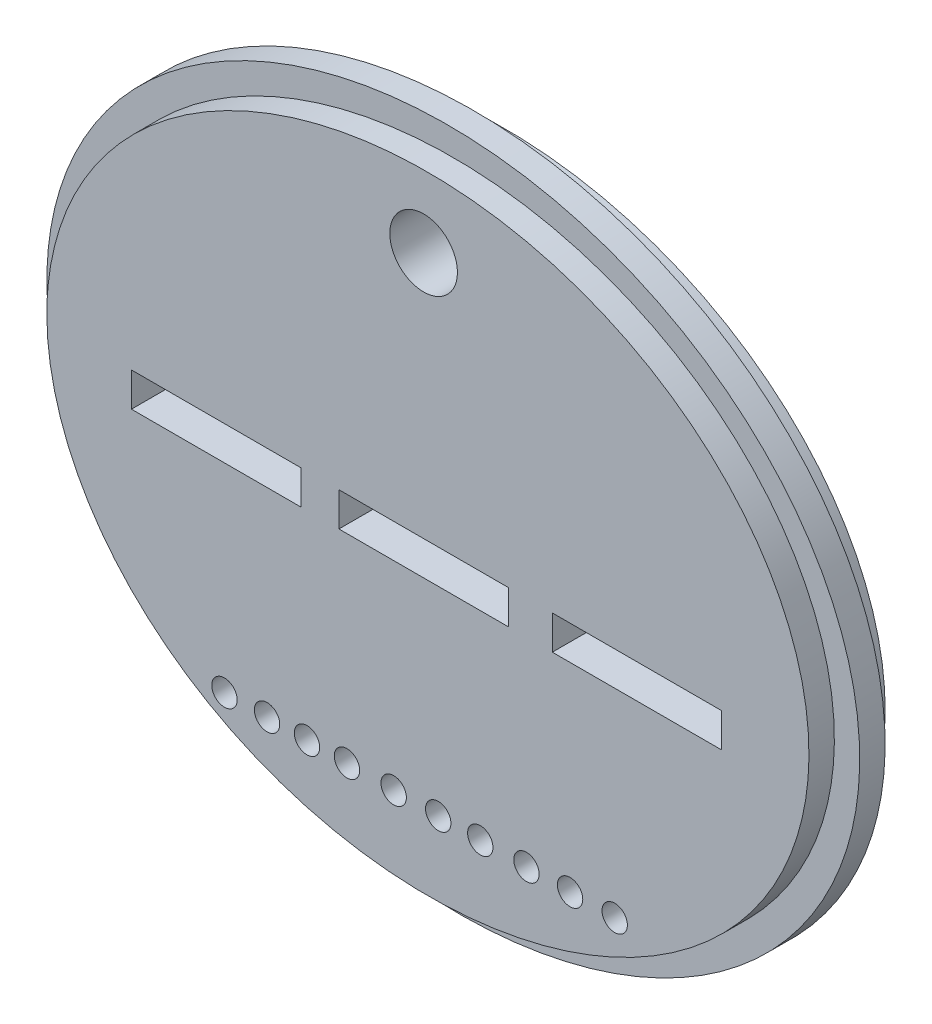
ISO-10303-21;
HEADER;
FILE_DESCRIPTION(('STEP AP214'),'2;1');
FILE_NAME('part.step','',(''),(''),'','','');
FILE_SCHEMA(('AUTOMOTIVE_DESIGN { 1 0 10303 214 1 1 1 1 }'));
ENDSEC;
DATA;
#1=APPLICATION_CONTEXT('core data for automotive mechanical design processes');
#2=APPLICATION_PROTOCOL_DEFINITION('international standard','automotive_design',2000,#1);
#3=PRODUCT_CONTEXT('',#1,'mechanical');
#4=PRODUCT('Part','Part','',(#3));
#5=PRODUCT_RELATED_PRODUCT_CATEGORY('part','',(#4));
#6=PRODUCT_DEFINITION_FORMATION('','',#4);
#7=PRODUCT_DEFINITION_CONTEXT('part definition',#1,'design');
#8=PRODUCT_DEFINITION('design','',#6,#7);
#9=PRODUCT_DEFINITION_SHAPE('','',#8);
#10=(LENGTH_UNIT() NAMED_UNIT(*) SI_UNIT(.MILLI.,.METRE.));
#11=(NAMED_UNIT(*) PLANE_ANGLE_UNIT() SI_UNIT($,.RADIAN.));
#12=(NAMED_UNIT(*) SI_UNIT($,.STERADIAN.) SOLID_ANGLE_UNIT());
#13=UNCERTAINTY_MEASURE_WITH_UNIT(LENGTH_MEASURE(1.E-05),#10,'distance_accuracy_value','');
#14=(GEOMETRIC_REPRESENTATION_CONTEXT(3) GLOBAL_UNCERTAINTY_ASSIGNED_CONTEXT((#13)) GLOBAL_UNIT_ASSIGNED_CONTEXT((#10,
#11,#12)) REPRESENTATION_CONTEXT('',''));
#15=CARTESIAN_POINT('',(0.,0.,0.));
#16=DIRECTION('',(0.,0.,1.));
#17=DIRECTION('',(1.,0.,0.));
#18=AXIS2_PLACEMENT_3D('',#15,#16,#17);
#19=CARTESIAN_POINT('',(0.,0.,3.));
#20=DIRECTION('',(0.,0.,1.));
#21=DIRECTION('',(-0.999405556384513,0.0344751195467531,0.));
#22=AXIS2_PLACEMENT_3D('',#19,#20,#21);
#23=ELLIPSE('',#22,48.,40.);
#24=DIRECTION('',(0.,0.,-1.));
#25=VECTOR('',#24,1.);
#26=SURFACE_OF_LINEAR_EXTRUSION('',#23,#25);
#27=CARTESIAN_POINT('',(-47.9714667064566,1.65480573824415,3.));
#28=VERTEX_POINT('',#27);
#29=EDGE_CURVE('E49',#28,#28,#23,.T.);
#30=ORIENTED_EDGE('',*,*,#29,.F.);
#31=EDGE_LOOP('',(#30));
#32=FACE_BOUND('',#31,.T.);
#33=CARTESIAN_POINT('',(0.,0.,0.));
#34=DIRECTION('',(0.,0.,1.));
#35=DIRECTION('',(-0.999405556384513,0.0344751195467531,0.));
#36=AXIS2_PLACEMENT_3D('',#33,#34,#35);
#37=ELLIPSE('',#36,48.,40.);
#38=CARTESIAN_POINT('',(-47.9714667064566,1.65480573824415,0.));
#39=VERTEX_POINT('',#38);
#40=EDGE_CURVE('E394',#39,#39,#37,.T.);
#41=ORIENTED_EDGE('',*,*,#40,.T.);
#42=EDGE_LOOP('',(#41));
#43=FACE_BOUND('',#42,.T.);
#44=ADVANCED_FACE('F39',(#32,#43),#26,.F.);
#45=CARTESIAN_POINT('',(0.,0.,3.));
#46=DIRECTION('',(0.,0.,1.));
#47=DIRECTION('',(1.,0.,0.));
#48=AXIS2_PLACEMENT_3D('',#45,#46,#47);
#49=PLANE('',#48);
#50=CARTESIAN_POINT('',(0.,0.,3.));
#51=DIRECTION('',(0.,0.,1.));
#52=DIRECTION('',(-1.,0.,0.));
#53=AXIS2_PLACEMENT_3D('',#50,#51,#52);
#54=ELLIPSE('',#53,45.,37.);
#55=CARTESIAN_POINT('',(-45.,0.,3.));
#56=VERTEX_POINT('',#55);
#57=EDGE_CURVE('E11',#56,#56,#54,.T.);
#58=ORIENTED_EDGE('',*,*,#57,.F.);
#59=EDGE_LOOP('',(#58));
#60=FACE_BOUND('',#59,.T.);
#61=ORIENTED_EDGE('',*,*,#29,.T.);
#62=EDGE_LOOP('',(#61));
#63=FACE_BOUND('',#62,.T.);
#64=ADVANCED_FACE('F373',(#60,#63),#49,.T.);
#65=CARTESIAN_POINT('',(0.,0.,0.));
#66=DIRECTION('',(0.,0.,1.));
#67=DIRECTION('',(1.,0.,0.));
#68=AXIS2_PLACEMENT_3D('',#65,#66,#67);
#69=PLANE('',#68);
#70=CARTESIAN_POINT('',(0.,0.,0.));
#71=DIRECTION('',(0.,0.,1.));
#72=DIRECTION('',(-1.,0.,0.));
#73=AXIS2_PLACEMENT_3D('',#70,#71,#72);
#74=ELLIPSE('',#73,45.,37.);
#75=CARTESIAN_POINT('',(-45.,0.,0.));
#76=VERTEX_POINT('',#75);
#77=EDGE_CURVE('E43',#76,#76,#74,.T.);
#78=ORIENTED_EDGE('',*,*,#77,.T.);
#79=EDGE_LOOP('',(#78));
#80=FACE_BOUND('',#79,.T.);
#81=ORIENTED_EDGE('',*,*,#40,.F.);
#82=EDGE_LOOP('',(#81));
#83=FACE_BOUND('',#82,.T.);
#84=ADVANCED_FACE('F375',(#80,#83),#69,.F.);
#85=CARTESIAN_POINT('',(0.,0.,-3.));
#86=DIRECTION('',(0.,0.,1.));
#87=DIRECTION('',(1.,0.,0.));
#88=AXIS2_PLACEMENT_3D('',#85,#86,#87);
#89=PLANE('',#88);
#90=CARTESIAN_POINT('',(16.7871489350802,-28.2262210024839,-3.));
#91=DIRECTION('',(0.,0.,1.));
#92=DIRECTION('',(1.,0.,0.));
#93=AXIS2_PLACEMENT_3D('',#90,#91,#92);
#94=CIRCLE('',#93,1.5);
#95=CARTESIAN_POINT('',(18.2871489350802,-28.2262210024839,-3.));
#96=VERTEX_POINT('',#95);
#97=EDGE_CURVE('E352',#96,#96,#94,.T.);
#98=ORIENTED_EDGE('',*,*,#97,.T.);
#99=EDGE_LOOP('',(#98));
#100=FACE_BOUND('',#99,.T.);
#101=CARTESIAN_POINT('',(11.6399103324198,-28.2262210024839,-3.));
#102=DIRECTION('',(0.,0.,1.));
#103=DIRECTION('',(1.,0.,0.));
#104=AXIS2_PLACEMENT_3D('',#101,#102,#103);
#105=CIRCLE('',#104,1.5);
#106=CARTESIAN_POINT('',(13.1399103324198,-28.2262210024839,-3.));
#107=VERTEX_POINT('',#106);
#108=EDGE_CURVE('E348',#107,#107,#105,.T.);
#109=ORIENTED_EDGE('',*,*,#108,.T.);
#110=EDGE_LOOP('',(#109));
#111=FACE_BOUND('',#110,.T.);
#112=CARTESIAN_POINT('',(6.18604048680282,-28.2262210024839,-3.));
#113=DIRECTION('',(0.,0.,1.));
#114=DIRECTION('',(1.,0.,0.));
#115=AXIS2_PLACEMENT_3D('',#112,#113,#114);
#116=CIRCLE('',#115,1.5);
#117=CARTESIAN_POINT('',(7.68604048680283,-28.2262210024839,-3.));
#118=VERTEX_POINT('',#117);
#119=EDGE_CURVE('E344',#118,#118,#116,.T.);
#120=ORIENTED_EDGE('',*,*,#119,.T.);
#121=EDGE_LOOP('',(#120));
#122=FACE_BOUND('',#121,.T.);
#123=CARTESIAN_POINT('',(1.22176721070844,-28.2262210024839,-3.));
#124=DIRECTION('',(0.,0.,1.));
#125=DIRECTION('',(1.,0.,0.));
#126=AXIS2_PLACEMENT_3D('',#123,#124,#125);
#127=CIRCLE('',#126,1.5);
#128=CARTESIAN_POINT('',(2.72176721070844,-28.2262210024839,-3.));
#129=VERTEX_POINT('',#128);
#130=EDGE_CURVE('E340',#129,#129,#127,.T.);
#131=ORIENTED_EDGE('',*,*,#130,.T.);
#132=EDGE_LOOP('',(#131));
#133=FACE_BOUND('',#132,.T.);
#134=CARTESIAN_POINT('',(-4.04378870700839,-28.2262210024839,-3.));
#135=DIRECTION('',(0.,0.,1.));
#136=DIRECTION('',(1.,0.,0.));
#137=AXIS2_PLACEMENT_3D('',#134,#135,#136);
#138=CIRCLE('',#137,1.5);
#139=CARTESIAN_POINT('',(-2.54378870700839,-28.2262210024839,-3.));
#140=VERTEX_POINT('',#139);
#141=EDGE_CURVE('E336',#140,#140,#138,.T.);
#142=ORIENTED_EDGE('',*,*,#141,.T.);
#143=EDGE_LOOP('',(#142));
#144=FACE_BOUND('',#143,.T.);
#145=CARTESIAN_POINT('',(-9.55886042839893,-28.2262210024839,-3.));
#146=DIRECTION('',(0.,0.,1.));
#147=DIRECTION('',(1.,0.,0.));
#148=AXIS2_PLACEMENT_3D('',#145,#146,#147);
#149=CIRCLE('',#148,1.5);
#150=CARTESIAN_POINT('',(-8.05886042839893,-28.2262210024839,-3.));
#151=VERTEX_POINT('',#150);
#152=EDGE_CURVE('E332',#151,#151,#149,.T.);
#153=ORIENTED_EDGE('',*,*,#152,.T.);
#154=EDGE_LOOP('',(#153));
#155=FACE_BOUND('',#154,.T.);
#156=CARTESIAN_POINT('',(-14.2767144594771,-28.226221002484,-3.));
#157=DIRECTION('',(0.,0.,1.));
#158=DIRECTION('',(1.,0.,0.));
#159=AXIS2_PLACEMENT_3D('',#156,#157,#158);
#160=CIRCLE('',#159,1.5);
#161=CARTESIAN_POINT('',(-12.7767144594771,-28.226221002484,-3.));
#162=VERTEX_POINT('',#161);
#163=EDGE_CURVE('E328',#162,#162,#160,.T.);
#164=ORIENTED_EDGE('',*,*,#163,.T.);
#165=EDGE_LOOP('',(#164));
#166=FACE_BOUND('',#165,.T.);
#167=CARTESIAN_POINT('',(-18.9953449348153,-28.226221002484,-3.));
#168=DIRECTION('',(0.,0.,1.));
#169=DIRECTION('',(1.,0.,0.));
#170=AXIS2_PLACEMENT_3D('',#167,#168,#169);
#171=CIRCLE('',#170,1.5);
#172=CARTESIAN_POINT('',(-17.4953449348153,-28.226221002484,-3.));
#173=VERTEX_POINT('',#172);
#174=EDGE_CURVE('E324',#173,#173,#171,.T.);
#175=ORIENTED_EDGE('',*,*,#174,.T.);
#176=EDGE_LOOP('',(#175));
#177=FACE_BOUND('',#176,.T.);
#178=DIRECTION('',(1.,0.,0.));
#179=VECTOR('',#178,1.);
#180=CARTESIAN_POINT('',(0.,-4.73896392291095,-3.));
#181=LINE('',#180,#179);
#182=CARTESIAN_POINT('',(-35.0077483121449,-4.73896392291095,-3.));
#183=VERTEX_POINT('',#182);
#184=CARTESIAN_POINT('',(-15.0077483121449,-4.73896392291095,-3.));
#185=VERTEX_POINT('',#184);
#186=EDGE_CURVE('E316',#183,#185,#181,.T.);
#187=ORIENTED_EDGE('',*,*,#186,.T.);
#188=DIRECTION('',(0.,1.,0.));
#189=VECTOR('',#188,1.);
#190=CARTESIAN_POINT('',(-15.0077483121449,0.,-3.));
#191=LINE('',#190,#189);
#192=CARTESIAN_POINT('',(-15.0077483121449,-0.723465120707094,-3.));
#193=VERTEX_POINT('',#192);
#194=EDGE_CURVE('E320',#185,#193,#191,.T.);
#195=ORIENTED_EDGE('',*,*,#194,.T.);
#196=DIRECTION('',(-1.,0.,0.));
#197=VECTOR('',#196,1.);
#198=CARTESIAN_POINT('',(0.,-0.723465120707092,-3.));
#199=LINE('',#198,#197);
#200=CARTESIAN_POINT('',(-35.0077483121449,-0.723465120707097,-3.));
#201=VERTEX_POINT('',#200);
#202=EDGE_CURVE('E308',#193,#201,#199,.T.);
#203=ORIENTED_EDGE('',*,*,#202,.T.);
#204=DIRECTION('',(0.,-1.,0.));
#205=VECTOR('',#204,1.);
#206=CARTESIAN_POINT('',(-35.0077483121449,0.,-3.));
#207=LINE('',#206,#205);
#208=EDGE_CURVE('E312',#201,#183,#207,.T.);
#209=ORIENTED_EDGE('',*,*,#208,.T.);
#210=EDGE_LOOP('',(#187,#195,#203,#209));
#211=FACE_BOUND('',#210,.T.);
#212=DIRECTION('',(1.,0.,0.));
#213=VECTOR('',#212,1.);
#214=CARTESIAN_POINT('',(0.,-4.73896392291095,-3.));
#215=LINE('',#214,#213);
#216=CARTESIAN_POINT('',(-10.5072318027535,-4.73896392291095,-3.));
#217=VERTEX_POINT('',#216);
#218=CARTESIAN_POINT('',(9.49276819724652,-4.73896392291095,-3.));
#219=VERTEX_POINT('',#218);
#220=EDGE_CURVE('E300',#217,#219,#215,.T.);
#221=ORIENTED_EDGE('',*,*,#220,.T.);
#222=DIRECTION('',(0.,1.,0.));
#223=VECTOR('',#222,1.);
#224=CARTESIAN_POINT('',(9.49276819724652,0.,-3.));
#225=LINE('',#224,#223);
#226=CARTESIAN_POINT('',(9.49276819724652,-0.723465120707092,-3.));
#227=VERTEX_POINT('',#226);
#228=EDGE_CURVE('E304',#219,#227,#225,.T.);
#229=ORIENTED_EDGE('',*,*,#228,.T.);
#230=DIRECTION('',(-1.,0.,0.));
#231=VECTOR('',#230,1.);
#232=CARTESIAN_POINT('',(0.,-0.723465120707093,-3.));
#233=LINE('',#232,#231);
#234=CARTESIAN_POINT('',(-10.5072318027535,-0.723465120707094,-3.));
#235=VERTEX_POINT('',#234);
#236=EDGE_CURVE('E295',#227,#235,#233,.T.);
#237=ORIENTED_EDGE('',*,*,#236,.T.);
#238=DIRECTION('',(0.,-1.,0.));
#239=VECTOR('',#238,1.);
#240=CARTESIAN_POINT('',(-10.5072318027535,0.,-3.));
#241=LINE('',#240,#239);
#242=EDGE_CURVE('E136',#235,#217,#241,.T.);
#243=ORIENTED_EDGE('',*,*,#242,.T.);
#244=EDGE_LOOP('',(#221,#229,#237,#243));
#245=FACE_BOUND('',#244,.T.);
#246=DIRECTION('',(1.,0.,0.));
#247=VECTOR('',#246,1.);
#248=CARTESIAN_POINT('',(0.,-4.73896392291096,-3.));
#249=LINE('',#248,#247);
#250=CARTESIAN_POINT('',(14.6929491709074,-4.73896392291095,-3.));
#251=VERTEX_POINT('',#250);
#252=CARTESIAN_POINT('',(34.6929491709074,-4.73896392291095,-3.));
#253=VERTEX_POINT('',#252);
#254=EDGE_CURVE('E287',#251,#253,#249,.T.);
#255=ORIENTED_EDGE('',*,*,#254,.T.);
#256=DIRECTION('',(0.,1.,0.));
#257=VECTOR('',#256,1.);
#258=CARTESIAN_POINT('',(34.6929491709074,0.,-3.));
#259=LINE('',#258,#257);
#260=CARTESIAN_POINT('',(34.6929491709074,-0.723465120707094,-3.));
#261=VERTEX_POINT('',#260);
#262=EDGE_CURVE('E291',#253,#261,#259,.T.);
#263=ORIENTED_EDGE('',*,*,#262,.T.);
#264=DIRECTION('',(-1.,0.,0.));
#265=VECTOR('',#264,1.);
#266=CARTESIAN_POINT('',(0.,-0.723465120707098,-3.));
#267=LINE('',#266,#265);
#268=CARTESIAN_POINT('',(14.6929491709074,-0.723465120707097,-3.));
#269=VERTEX_POINT('',#268);
#270=EDGE_CURVE('E279',#261,#269,#267,.T.);
#271=ORIENTED_EDGE('',*,*,#270,.T.);
#272=DIRECTION('',(0.,-1.,0.));
#273=VECTOR('',#272,1.);
#274=CARTESIAN_POINT('',(14.6929491709074,0.,-3.));
#275=LINE('',#274,#273);
#276=EDGE_CURVE('E283',#269,#251,#275,.T.);
#277=ORIENTED_EDGE('',*,*,#276,.T.);
#278=EDGE_LOOP('',(#255,#263,#271,#277));
#279=FACE_BOUND('',#278,.T.);
#280=CARTESIAN_POINT('',(-24.0239847170827,-28.226221002484,-3.));
#281=DIRECTION('',(0.,0.,1.));
#282=DIRECTION('',(1.,0.,0.));
#283=AXIS2_PLACEMENT_3D('',#280,#281,#282);
#284=CIRCLE('',#283,1.5);
#285=CARTESIAN_POINT('',(-22.5239847170827,-28.226221002484,-3.));
#286=VERTEX_POINT('',#285);
#287=EDGE_CURVE('E275',#286,#286,#284,.T.);
#288=ORIENTED_EDGE('',*,*,#287,.T.);
#289=EDGE_LOOP('',(#288));
#290=FACE_BOUND('',#289,.T.);
#291=CARTESIAN_POINT('',(-0.507231802753479,28.4930066817388,-3.));
#292=DIRECTION('',(0.,0.,1.));
#293=DIRECTION('',(1.,0.,0.));
#294=AXIS2_PLACEMENT_3D('',#291,#292,#293);
#295=CIRCLE('',#294,3.99291984746983);
#296=CARTESIAN_POINT('',(3.48568804471635,28.4930066817388,-3.));
#297=VERTEX_POINT('',#296);
#298=EDGE_CURVE('E271',#297,#297,#295,.T.);
#299=ORIENTED_EDGE('',*,*,#298,.T.);
#300=EDGE_LOOP('',(#299));
#301=FACE_BOUND('',#300,.T.);
#302=CARTESIAN_POINT('',(22.0580534541241,-28.2262210024839,-3.));
#303=DIRECTION('',(0.,0.,1.));
#304=DIRECTION('',(1.,0.,0.));
#305=AXIS2_PLACEMENT_3D('',#302,#303,#304);
#306=CIRCLE('',#305,1.5);
#307=CARTESIAN_POINT('',(23.5580534541242,-28.2262210024839,-3.));
#308=VERTEX_POINT('',#307);
#309=EDGE_CURVE('E267',#308,#308,#306,.T.);
#310=ORIENTED_EDGE('',*,*,#309,.T.);
#311=EDGE_LOOP('',(#310));
#312=FACE_BOUND('',#311,.T.);
#313=CARTESIAN_POINT('',(0.,0.,-3.));
#314=DIRECTION('',(0.,0.,1.));
#315=DIRECTION('',(-1.,0.,0.));
#316=AXIS2_PLACEMENT_3D('',#313,#314,#315);
#317=ELLIPSE('',#316,45.,37.);
#318=CARTESIAN_POINT('',(-45.,0.,-3.));
#319=VERTEX_POINT('',#318);
#320=EDGE_CURVE('E360',#319,#319,#317,.T.);
#321=ORIENTED_EDGE('',*,*,#320,.F.);
#322=EDGE_LOOP('',(#321));
#323=FACE_BOUND('',#322,.T.);
#324=ADVANCED_FACE('F371',(#100,#111,#122,#133,#144,#155,#166,#177,#211,#245,#279,#290,#301,
#312,#323),#89,.F.);
#325=DIRECTION('',(0.,0.,1.));
#326=VECTOR('',#325,1.);
#327=SURFACE_OF_LINEAR_EXTRUSION('',#317,#326);
#328=ORIENTED_EDGE('',*,*,#320,.T.);
#329=EDGE_LOOP('',(#328));
#330=FACE_BOUND('',#329,.T.);
#331=ORIENTED_EDGE('',*,*,#77,.F.);
#332=EDGE_LOOP('',(#331));
#333=FACE_BOUND('',#332,.T.);
#334=ADVANCED_FACE('F369',(#330,#333),#327,.T.);
#335=ORIENTED_EDGE('',*,*,#57,.T.);
#336=EDGE_LOOP('',(#335));
#337=FACE_BOUND('',#336,.T.);
#338=CARTESIAN_POINT('',(0.,0.,6.));
#339=DIRECTION('',(0.,0.,1.));
#340=DIRECTION('',(-1.,0.,0.));
#341=AXIS2_PLACEMENT_3D('',#338,#339,#340);
#342=ELLIPSE('',#341,45.,37.);
#343=CARTESIAN_POINT('',(-45.,0.,6.));
#344=VERTEX_POINT('',#343);
#345=EDGE_CURVE('E356',#344,#344,#342,.T.);
#346=ORIENTED_EDGE('',*,*,#345,.F.);
#347=EDGE_LOOP('',(#346));
#348=FACE_BOUND('',#347,.T.);
#349=ADVANCED_FACE('F365',(#337,#348),#327,.T.);
#350=CARTESIAN_POINT('',(0.,0.,6.));
#351=DIRECTION('',(0.,0.,1.));
#352=DIRECTION('',(1.,0.,0.));
#353=AXIS2_PLACEMENT_3D('',#350,#351,#352);
#354=PLANE('',#353);
#355=CARTESIAN_POINT('',(16.7871489350802,-28.2262210024839,6.));
#356=DIRECTION('',(0.,0.,1.));
#357=DIRECTION('',(1.,0.,0.));
#358=AXIS2_PLACEMENT_3D('',#355,#356,#357);
#359=CIRCLE('',#358,1.5);
#360=CARTESIAN_POINT('',(18.2871489350802,-28.2262210024839,6.));
#361=VERTEX_POINT('',#360);
#362=EDGE_CURVE('E232',#361,#361,#359,.T.);
#363=ORIENTED_EDGE('',*,*,#362,.F.);
#364=EDGE_LOOP('',(#363));
#365=FACE_BOUND('',#364,.T.);
#366=CARTESIAN_POINT('',(11.6399103324198,-28.2262210024839,6.));
#367=DIRECTION('',(0.,0.,1.));
#368=DIRECTION('',(1.,0.,0.));
#369=AXIS2_PLACEMENT_3D('',#366,#367,#368);
#370=CIRCLE('',#369,1.5);
#371=CARTESIAN_POINT('',(13.1399103324198,-28.2262210024839,6.));
#372=VERTEX_POINT('',#371);
#373=EDGE_CURVE('E237',#372,#372,#370,.T.);
#374=ORIENTED_EDGE('',*,*,#373,.F.);
#375=EDGE_LOOP('',(#374));
#376=FACE_BOUND('',#375,.T.);
#377=CARTESIAN_POINT('',(6.18604048680282,-28.2262210024839,6.));
#378=DIRECTION('',(0.,0.,1.));
#379=DIRECTION('',(1.,0.,0.));
#380=AXIS2_PLACEMENT_3D('',#377,#378,#379);
#381=CIRCLE('',#380,1.5);
#382=CARTESIAN_POINT('',(7.68604048680283,-28.2262210024839,6.));
#383=VERTEX_POINT('',#382);
#384=EDGE_CURVE('E241',#383,#383,#381,.T.);
#385=ORIENTED_EDGE('',*,*,#384,.F.);
#386=EDGE_LOOP('',(#385));
#387=FACE_BOUND('',#386,.T.);
#388=CARTESIAN_POINT('',(1.22176721070844,-28.2262210024839,6.));
#389=DIRECTION('',(0.,0.,1.));
#390=DIRECTION('',(1.,0.,0.));
#391=AXIS2_PLACEMENT_3D('',#388,#389,#390);
#392=CIRCLE('',#391,1.5);
#393=CARTESIAN_POINT('',(2.72176721070844,-28.2262210024839,6.));
#394=VERTEX_POINT('',#393);
#395=EDGE_CURVE('E245',#394,#394,#392,.T.);
#396=ORIENTED_EDGE('',*,*,#395,.F.);
#397=EDGE_LOOP('',(#396));
#398=FACE_BOUND('',#397,.T.);
#399=CARTESIAN_POINT('',(-4.04378870700839,-28.2262210024839,6.));
#400=DIRECTION('',(0.,0.,1.));
#401=DIRECTION('',(1.,0.,0.));
#402=AXIS2_PLACEMENT_3D('',#399,#400,#401);
#403=CIRCLE('',#402,1.5);
#404=CARTESIAN_POINT('',(-2.54378870700839,-28.2262210024839,6.));
#405=VERTEX_POINT('',#404);
#406=EDGE_CURVE('E249',#405,#405,#403,.T.);
#407=ORIENTED_EDGE('',*,*,#406,.F.);
#408=EDGE_LOOP('',(#407));
#409=FACE_BOUND('',#408,.T.);
#410=CARTESIAN_POINT('',(-9.55886042839893,-28.2262210024839,6.));
#411=DIRECTION('',(0.,0.,1.));
#412=DIRECTION('',(1.,0.,0.));
#413=AXIS2_PLACEMENT_3D('',#410,#411,#412);
#414=CIRCLE('',#413,1.5);
#415=CARTESIAN_POINT('',(-8.05886042839893,-28.2262210024839,6.));
#416=VERTEX_POINT('',#415);
#417=EDGE_CURVE('E253',#416,#416,#414,.T.);
#418=ORIENTED_EDGE('',*,*,#417,.F.);
#419=EDGE_LOOP('',(#418));
#420=FACE_BOUND('',#419,.T.);
#421=CARTESIAN_POINT('',(-14.2767144594771,-28.226221002484,6.));
#422=DIRECTION('',(0.,0.,1.));
#423=DIRECTION('',(1.,0.,0.));
#424=AXIS2_PLACEMENT_3D('',#421,#422,#423);
#425=CIRCLE('',#424,1.5);
#426=CARTESIAN_POINT('',(-12.7767144594771,-28.226221002484,6.));
#427=VERTEX_POINT('',#426);
#428=EDGE_CURVE('E257',#427,#427,#425,.T.);
#429=ORIENTED_EDGE('',*,*,#428,.F.);
#430=EDGE_LOOP('',(#429));
#431=FACE_BOUND('',#430,.T.);
#432=CARTESIAN_POINT('',(-18.9953449348153,-28.226221002484,6.));
#433=DIRECTION('',(0.,0.,1.));
#434=DIRECTION('',(1.,0.,0.));
#435=AXIS2_PLACEMENT_3D('',#432,#433,#434);
#436=CIRCLE('',#435,1.5);
#437=CARTESIAN_POINT('',(-17.4953449348153,-28.226221002484,6.));
#438=VERTEX_POINT('',#437);
#439=EDGE_CURVE('E201',#438,#438,#436,.T.);
#440=ORIENTED_EDGE('',*,*,#439,.F.);
#441=EDGE_LOOP('',(#440));
#442=FACE_BOUND('',#441,.T.);
#443=DIRECTION('',(0.,1.,0.));
#444=VECTOR('',#443,1.);
#445=CARTESIAN_POINT('',(-15.0077483121449,-4.73896392291095,6.));
#446=LINE('',#445,#444);
#447=CARTESIAN_POINT('',(-15.0077483121449,-4.73896392291095,6.));
#448=VERTEX_POINT('',#447);
#449=CARTESIAN_POINT('',(-15.0077483121449,-0.723465120707094,6.));
#450=VERTEX_POINT('',#449);
#451=EDGE_CURVE('E170',#448,#450,#446,.T.);
#452=ORIENTED_EDGE('',*,*,#451,.F.);
#453=DIRECTION('',(1.,0.,0.));
#454=VECTOR('',#453,1.);
#455=CARTESIAN_POINT('',(-15.0077483121449,-4.73896392291095,6.));
#456=LINE('',#455,#454);
#457=CARTESIAN_POINT('',(-35.0077483121449,-4.73896392291095,6.));
#458=VERTEX_POINT('',#457);
#459=EDGE_CURVE('E181',#458,#448,#456,.T.);
#460=ORIENTED_EDGE('',*,*,#459,.F.);
#461=DIRECTION('',(0.,-1.,0.));
#462=VECTOR('',#461,1.);
#463=CARTESIAN_POINT('',(-35.0077483121449,-4.73896392291095,6.));
#464=LINE('',#463,#462);
#465=CARTESIAN_POINT('',(-35.0077483121449,-0.723465120707097,6.));
#466=VERTEX_POINT('',#465);
#467=EDGE_CURVE('E177',#466,#458,#464,.T.);
#468=ORIENTED_EDGE('',*,*,#467,.F.);
#469=DIRECTION('',(-1.,0.,0.));
#470=VECTOR('',#469,1.);
#471=CARTESIAN_POINT('',(-15.0077483121449,-0.723465120707094,6.));
#472=LINE('',#471,#470);
#473=EDGE_CURVE('E173',#450,#466,#472,.T.);
#474=ORIENTED_EDGE('',*,*,#473,.F.);
#475=EDGE_LOOP('',(#452,#460,#468,#474));
#476=FACE_BOUND('',#475,.T.);
#477=DIRECTION('',(0.,1.,0.));
#478=VECTOR('',#477,1.);
#479=CARTESIAN_POINT('',(9.49276819724652,-4.73896392291095,6.));
#480=LINE('',#479,#478);
#481=CARTESIAN_POINT('',(9.49276819724652,-4.73896392291095,6.));
#482=VERTEX_POINT('',#481);
#483=CARTESIAN_POINT('',(9.49276819724652,-0.723465120707092,6.));
#484=VERTEX_POINT('',#483);
#485=EDGE_CURVE('E150',#482,#484,#480,.T.);
#486=ORIENTED_EDGE('',*,*,#485,.F.);
#487=DIRECTION('',(1.,0.,0.));
#488=VECTOR('',#487,1.);
#489=CARTESIAN_POINT('',(9.49276819724652,-4.73896392291095,6.));
#490=LINE('',#489,#488);
#491=CARTESIAN_POINT('',(-10.5072318027535,-4.73896392291095,6.));
#492=VERTEX_POINT('',#491);
#493=EDGE_CURVE('E155',#492,#482,#490,.T.);
#494=ORIENTED_EDGE('',*,*,#493,.F.);
#495=DIRECTION('',(0.,-1.,0.));
#496=VECTOR('',#495,1.);
#497=CARTESIAN_POINT('',(-10.5072318027535,-4.73896392291095,6.));
#498=LINE('',#497,#496);
#499=CARTESIAN_POINT('',(-10.5072318027535,-0.723465120707094,6.));
#500=VERTEX_POINT('',#499);
#501=EDGE_CURVE('E133',#500,#492,#498,.T.);
#502=ORIENTED_EDGE('',*,*,#501,.F.);
#503=DIRECTION('',(-1.,0.,0.));
#504=VECTOR('',#503,1.);
#505=CARTESIAN_POINT('',(9.49276819724652,-0.723465120707092,6.));
#506=LINE('',#505,#504);
#507=EDGE_CURVE('E144',#484,#500,#506,.T.);
#508=ORIENTED_EDGE('',*,*,#507,.F.);
#509=EDGE_LOOP('',(#486,#494,#502,#508));
#510=FACE_BOUND('',#509,.T.);
#511=DIRECTION('',(0.,1.,0.));
#512=VECTOR('',#511,1.);
#513=CARTESIAN_POINT('',(34.6929491709074,-0.723465120707094,6.));
#514=LINE('',#513,#512);
#515=CARTESIAN_POINT('',(34.6929491709074,-4.73896392291095,6.));
#516=VERTEX_POINT('',#515);
#517=CARTESIAN_POINT('',(34.6929491709074,-0.723465120707094,6.));
#518=VERTEX_POINT('',#517);
#519=EDGE_CURVE('E165',#516,#518,#514,.T.);
#520=ORIENTED_EDGE('',*,*,#519,.F.);
#521=DIRECTION('',(1.,0.,0.));
#522=VECTOR('',#521,1.);
#523=CARTESIAN_POINT('',(34.6929491709074,-4.73896392291095,6.));
#524=LINE('',#523,#522);
#525=CARTESIAN_POINT('',(14.6929491709074,-4.73896392291095,6.));
#526=VERTEX_POINT('',#525);
#527=EDGE_CURVE('E213',#526,#516,#524,.T.);
#528=ORIENTED_EDGE('',*,*,#527,.F.);
#529=DIRECTION('',(0.,-1.,0.));
#530=VECTOR('',#529,1.);
#531=CARTESIAN_POINT('',(14.6929491709074,-0.723465120707097,6.));
#532=LINE('',#531,#530);
#533=CARTESIAN_POINT('',(14.6929491709074,-0.723465120707097,6.));
#534=VERTEX_POINT('',#533);
#535=EDGE_CURVE('E209',#534,#526,#532,.T.);
#536=ORIENTED_EDGE('',*,*,#535,.F.);
#537=DIRECTION('',(-1.,0.,0.));
#538=VECTOR('',#537,1.);
#539=CARTESIAN_POINT('',(34.6929491709074,-0.723465120707094,6.));
#540=LINE('',#539,#538);
#541=EDGE_CURVE('E205',#518,#534,#540,.T.);
#542=ORIENTED_EDGE('',*,*,#541,.F.);
#543=EDGE_LOOP('',(#520,#528,#536,#542));
#544=FACE_BOUND('',#543,.T.);
#545=CARTESIAN_POINT('',(-24.0239847170827,-28.226221002484,6.));
#546=DIRECTION('',(0.,0.,1.));
#547=DIRECTION('',(1.,0.,0.));
#548=AXIS2_PLACEMENT_3D('',#545,#546,#547);
#549=CIRCLE('',#548,1.5);
#550=CARTESIAN_POINT('',(-22.5239847170827,-28.226221002484,6.));
#551=VERTEX_POINT('',#550);
#552=EDGE_CURVE('E197',#551,#551,#549,.T.);
#553=ORIENTED_EDGE('',*,*,#552,.F.);
#554=EDGE_LOOP('',(#553));
#555=FACE_BOUND('',#554,.T.);
#556=CARTESIAN_POINT('',(-0.507231802753479,28.4930066817388,6.));
#557=DIRECTION('',(0.,0.,1.));
#558=DIRECTION('',(1.,0.,0.));
#559=AXIS2_PLACEMENT_3D('',#556,#557,#558);
#560=CIRCLE('',#559,3.99291984746983);
#561=CARTESIAN_POINT('',(3.48568804471635,28.4930066817388,6.));
#562=VERTEX_POINT('',#561);
#563=EDGE_CURVE('E174',#562,#562,#560,.T.);
#564=ORIENTED_EDGE('',*,*,#563,.F.);
#565=EDGE_LOOP('',(#564));
#566=FACE_BOUND('',#565,.T.);
#567=CARTESIAN_POINT('',(22.0580534541241,-28.2262210024839,6.));
#568=DIRECTION('',(0.,0.,1.));
#569=DIRECTION('',(1.,0.,0.));
#570=AXIS2_PLACEMENT_3D('',#567,#568,#569);
#571=CIRCLE('',#570,1.5);
#572=CARTESIAN_POINT('',(23.5580534541242,-28.2262210024839,6.));
#573=VERTEX_POINT('',#572);
#574=EDGE_CURVE('E236',#573,#573,#571,.T.);
#575=ORIENTED_EDGE('',*,*,#574,.F.);
#576=EDGE_LOOP('',(#575));
#577=FACE_BOUND('',#576,.T.);
#578=ORIENTED_EDGE('',*,*,#345,.T.);
#579=EDGE_LOOP('',(#578));
#580=FACE_BOUND('',#579,.T.);
#581=ADVANCED_FACE('F152',(#365,#376,#387,#398,#409,#420,#431,#442,#476,#510,#544,#555,#566,
#577,#580),#354,.T.);
#582=CARTESIAN_POINT('',(22.0580534541241,-28.2262210024839,-8.));
#583=DIRECTION('',(0.,0.,1.));
#584=DIRECTION('',(1.,0.,0.));
#585=AXIS2_PLACEMENT_3D('',#582,#583,#584);
#586=CYLINDRICAL_SURFACE('',#585,1.5);
#587=ORIENTED_EDGE('',*,*,#574,.T.);
#588=EDGE_LOOP('',(#587));
#589=FACE_BOUND('',#588,.T.);
#590=ORIENTED_EDGE('',*,*,#309,.F.);
#591=EDGE_LOOP('',(#590));
#592=FACE_BOUND('',#591,.T.);
#593=ADVANCED_FACE('F419',(#589,#592),#586,.F.);
#594=CARTESIAN_POINT('',(-0.507231802753479,28.4930066817388,-8.));
#595=DIRECTION('',(0.,0.,1.));
#596=DIRECTION('',(1.,0.,0.));
#597=AXIS2_PLACEMENT_3D('',#594,#595,#596);
#598=CYLINDRICAL_SURFACE('',#597,3.99291984746983);
#599=ORIENTED_EDGE('',*,*,#563,.T.);
#600=EDGE_LOOP('',(#599));
#601=FACE_BOUND('',#600,.T.);
#602=ORIENTED_EDGE('',*,*,#298,.F.);
#603=EDGE_LOOP('',(#602));
#604=FACE_BOUND('',#603,.T.);
#605=ADVANCED_FACE('F426',(#601,#604),#598,.F.);
#606=CARTESIAN_POINT('',(-24.0239847170827,-28.226221002484,-8.));
#607=DIRECTION('',(0.,0.,1.));
#608=DIRECTION('',(1.,0.,0.));
#609=AXIS2_PLACEMENT_3D('',#606,#607,#608);
#610=CYLINDRICAL_SURFACE('',#609,1.5);
#611=ORIENTED_EDGE('',*,*,#552,.T.);
#612=EDGE_LOOP('',(#611));
#613=FACE_BOUND('',#612,.T.);
#614=ORIENTED_EDGE('',*,*,#287,.F.);
#615=EDGE_LOOP('',(#614));
#616=FACE_BOUND('',#615,.T.);
#617=ADVANCED_FACE('F434',(#613,#616),#610,.F.);
#618=CARTESIAN_POINT('',(34.6929491709074,-0.723465120707094,-8.));
#619=DIRECTION('',(1.,0.,0.));
#620=DIRECTION('',(0.,0.,-1.));
#621=AXIS2_PLACEMENT_3D('',#618,#619,#620);
#622=PLANE('',#621);
#623=DIRECTION('',(0.,0.,1.));
#624=VECTOR('',#623,1.);
#625=CARTESIAN_POINT('',(34.6929491709074,-4.73896392291095,-8.));
#626=LINE('',#625,#624);
#627=EDGE_CURVE('E202',#253,#516,#626,.T.);
#628=ORIENTED_EDGE('',*,*,#627,.T.);
#629=ORIENTED_EDGE('',*,*,#519,.T.);
#630=DIRECTION('',(0.,0.,1.));
#631=VECTOR('',#630,1.);
#632=CARTESIAN_POINT('',(34.6929491709074,-0.723465120707094,-8.));
#633=LINE('',#632,#631);
#634=EDGE_CURVE('E217',#261,#518,#633,.T.);
#635=ORIENTED_EDGE('',*,*,#634,.F.);
#636=ORIENTED_EDGE('',*,*,#262,.F.);
#637=EDGE_LOOP('',(#628,#629,#635,#636));
#638=FACE_BOUND('',#637,.T.);
#639=ADVANCED_FACE('F442',(#638),#622,.F.);
#640=CARTESIAN_POINT('',(34.6929491709074,-4.73896392291095,-8.));
#641=DIRECTION('',(0.,-1.,0.));
#642=DIRECTION('',(1.,0.,0.));
#643=AXIS2_PLACEMENT_3D('',#640,#641,#642);
#644=PLANE('',#643);
#645=DIRECTION('',(0.,0.,1.));
#646=VECTOR('',#645,1.);
#647=CARTESIAN_POINT('',(14.6929491709074,-4.73896392291095,-8.));
#648=LINE('',#647,#646);
#649=EDGE_CURVE('E220',#251,#526,#648,.T.);
#650=ORIENTED_EDGE('',*,*,#649,.T.);
#651=ORIENTED_EDGE('',*,*,#527,.T.);
#652=ORIENTED_EDGE('',*,*,#627,.F.);
#653=ORIENTED_EDGE('',*,*,#254,.F.);
#654=EDGE_LOOP('',(#650,#651,#652,#653));
#655=FACE_BOUND('',#654,.T.);
#656=ADVANCED_FACE('F450',(#655),#644,.F.);
#657=CARTESIAN_POINT('',(14.6929491709074,-0.723465120707097,-8.));
#658=DIRECTION('',(-1.,0.,0.));
#659=DIRECTION('',(0.,0.,1.));
#660=AXIS2_PLACEMENT_3D('',#657,#658,#659);
#661=PLANE('',#660);
#662=DIRECTION('',(0.,0.,1.));
#663=VECTOR('',#662,1.);
#664=CARTESIAN_POINT('',(14.6929491709074,-0.723465120707097,-8.));
#665=LINE('',#664,#663);
#666=EDGE_CURVE('E223',#269,#534,#665,.T.);
#667=ORIENTED_EDGE('',*,*,#666,.T.);
#668=ORIENTED_EDGE('',*,*,#535,.T.);
#669=ORIENTED_EDGE('',*,*,#649,.F.);
#670=ORIENTED_EDGE('',*,*,#276,.F.);
#671=EDGE_LOOP('',(#667,#668,#669,#670));
#672=FACE_BOUND('',#671,.T.);
#673=ADVANCED_FACE('F458',(#672),#661,.F.);
#674=CARTESIAN_POINT('',(34.6929491709074,-0.723465120707094,-8.));
#675=DIRECTION('',(0.,1.,0.));
#676=DIRECTION('',(-1.,0.,0.));
#677=AXIS2_PLACEMENT_3D('',#674,#675,#676);
#678=PLANE('',#677);
#679=ORIENTED_EDGE('',*,*,#634,.T.);
#680=ORIENTED_EDGE('',*,*,#541,.T.);
#681=ORIENTED_EDGE('',*,*,#666,.F.);
#682=ORIENTED_EDGE('',*,*,#270,.F.);
#683=EDGE_LOOP('',(#679,#680,#681,#682));
#684=FACE_BOUND('',#683,.T.);
#685=ADVANCED_FACE('F466',(#684),#678,.F.);
#686=CARTESIAN_POINT('',(9.49276819724652,-4.73896392291095,-8.));
#687=DIRECTION('',(1.,0.,0.));
#688=DIRECTION('',(0.,0.,-1.));
#689=AXIS2_PLACEMENT_3D('',#686,#687,#688);
#690=PLANE('',#689);
#691=DIRECTION('',(0.,0.,1.));
#692=VECTOR('',#691,1.);
#693=CARTESIAN_POINT('',(9.49276819724652,-4.73896392291095,-8.));
#694=LINE('',#693,#692);
#695=EDGE_CURVE('E162',#219,#482,#694,.T.);
#696=ORIENTED_EDGE('',*,*,#695,.T.);
#697=ORIENTED_EDGE('',*,*,#485,.T.);
#698=DIRECTION('',(0.,0.,1.));
#699=VECTOR('',#698,1.);
#700=CARTESIAN_POINT('',(9.49276819724652,-0.723465120707092,-8.));
#701=LINE('',#700,#699);
#702=EDGE_CURVE('E140',#227,#484,#701,.T.);
#703=ORIENTED_EDGE('',*,*,#702,.F.);
#704=ORIENTED_EDGE('',*,*,#228,.F.);
#705=EDGE_LOOP('',(#696,#697,#703,#704));
#706=FACE_BOUND('',#705,.T.);
#707=ADVANCED_FACE('F474',(#706),#690,.F.);
#708=CARTESIAN_POINT('',(9.49276819724652,-4.73896392291095,-8.));
#709=DIRECTION('',(0.,-1.,0.));
#710=DIRECTION('',(1.,0.,0.));
#711=AXIS2_PLACEMENT_3D('',#708,#709,#710);
#712=PLANE('',#711);
#713=DIRECTION('',(0.,0.,1.));
#714=VECTOR('',#713,1.);
#715=CARTESIAN_POINT('',(-10.5072318027535,-4.73896392291095,-8.));
#716=LINE('',#715,#714);
#717=EDGE_CURVE('E139',#217,#492,#716,.T.);
#718=ORIENTED_EDGE('',*,*,#717,.T.);
#719=ORIENTED_EDGE('',*,*,#493,.T.);
#720=ORIENTED_EDGE('',*,*,#695,.F.);
#721=ORIENTED_EDGE('',*,*,#220,.F.);
#722=EDGE_LOOP('',(#718,#719,#720,#721));
#723=FACE_BOUND('',#722,.T.);
#724=ADVANCED_FACE('F482',(#723),#712,.F.);
#725=CARTESIAN_POINT('',(-10.5072318027535,-4.73896392291095,-8.));
#726=DIRECTION('',(-1.,0.,0.));
#727=DIRECTION('',(0.,0.,1.));
#728=AXIS2_PLACEMENT_3D('',#725,#726,#727);
#729=PLANE('',#728);
#730=DIRECTION('',(0.,0.,1.));
#731=VECTOR('',#730,1.);
#732=CARTESIAN_POINT('',(-10.5072318027535,-0.723465120707094,-8.));
#733=LINE('',#732,#731);
#734=EDGE_CURVE('E65',#235,#500,#733,.T.);
#735=ORIENTED_EDGE('',*,*,#734,.T.);
#736=ORIENTED_EDGE('',*,*,#501,.T.);
#737=ORIENTED_EDGE('',*,*,#717,.F.);
#738=ORIENTED_EDGE('',*,*,#242,.F.);
#739=EDGE_LOOP('',(#735,#736,#737,#738));
#740=FACE_BOUND('',#739,.T.);
#741=ADVANCED_FACE('F130',(#740),#729,.F.);
#742=CARTESIAN_POINT('',(9.49276819724652,-0.723465120707092,-8.));
#743=DIRECTION('',(0.,1.,0.));
#744=DIRECTION('',(-1.,0.,0.));
#745=AXIS2_PLACEMENT_3D('',#742,#743,#744);
#746=PLANE('',#745);
#747=ORIENTED_EDGE('',*,*,#702,.T.);
#748=ORIENTED_EDGE('',*,*,#507,.T.);
#749=ORIENTED_EDGE('',*,*,#734,.F.);
#750=ORIENTED_EDGE('',*,*,#236,.F.);
#751=EDGE_LOOP('',(#747,#748,#749,#750));
#752=FACE_BOUND('',#751,.T.);
#753=ADVANCED_FACE('F145',(#752),#746,.F.);
#754=CARTESIAN_POINT('',(-15.0077483121449,-4.73896392291095,-8.));
#755=DIRECTION('',(1.,0.,0.));
#756=DIRECTION('',(0.,0.,-1.));
#757=AXIS2_PLACEMENT_3D('',#754,#755,#756);
#758=PLANE('',#757);
#759=DIRECTION('',(0.,0.,1.));
#760=VECTOR('',#759,1.);
#761=CARTESIAN_POINT('',(-15.0077483121449,-4.73896392291095,-8.));
#762=LINE('',#761,#760);
#763=EDGE_CURVE('E186',#185,#448,#762,.T.);
#764=ORIENTED_EDGE('',*,*,#763,.T.);
#765=ORIENTED_EDGE('',*,*,#451,.T.);
#766=DIRECTION('',(0.,0.,1.));
#767=VECTOR('',#766,1.);
#768=CARTESIAN_POINT('',(-15.0077483121449,-0.723465120707094,-8.));
#769=LINE('',#768,#767);
#770=EDGE_CURVE('E185',#193,#450,#769,.T.);
#771=ORIENTED_EDGE('',*,*,#770,.F.);
#772=ORIENTED_EDGE('',*,*,#194,.F.);
#773=EDGE_LOOP('',(#764,#765,#771,#772));
#774=FACE_BOUND('',#773,.T.);
#775=ADVANCED_FACE('F503',(#774),#758,.F.);
#776=CARTESIAN_POINT('',(-15.0077483121449,-4.73896392291095,-8.));
#777=DIRECTION('',(0.,-1.,0.));
#778=DIRECTION('',(1.,0.,0.));
#779=AXIS2_PLACEMENT_3D('',#776,#777,#778);
#780=PLANE('',#779);
#781=DIRECTION('',(0.,0.,1.));
#782=VECTOR('',#781,1.);
#783=CARTESIAN_POINT('',(-35.0077483121449,-4.73896392291095,-8.));
#784=LINE('',#783,#782);
#785=EDGE_CURVE('E189',#183,#458,#784,.T.);
#786=ORIENTED_EDGE('',*,*,#785,.T.);
#787=ORIENTED_EDGE('',*,*,#459,.T.);
#788=ORIENTED_EDGE('',*,*,#763,.F.);
#789=ORIENTED_EDGE('',*,*,#186,.F.);
#790=EDGE_LOOP('',(#786,#787,#788,#789));
#791=FACE_BOUND('',#790,.T.);
#792=ADVANCED_FACE('F510',(#791),#780,.F.);
#793=CARTESIAN_POINT('',(-35.0077483121449,-4.73896392291095,-8.));
#794=DIRECTION('',(-1.,0.,0.));
#795=DIRECTION('',(0.,0.,1.));
#796=AXIS2_PLACEMENT_3D('',#793,#794,#795);
#797=PLANE('',#796);
#798=DIRECTION('',(0.,0.,1.));
#799=VECTOR('',#798,1.);
#800=CARTESIAN_POINT('',(-35.0077483121449,-0.723465120707097,-8.));
#801=LINE('',#800,#799);
#802=EDGE_CURVE('E57',#201,#466,#801,.T.);
#803=ORIENTED_EDGE('',*,*,#802,.T.);
#804=ORIENTED_EDGE('',*,*,#467,.T.);
#805=ORIENTED_EDGE('',*,*,#785,.F.);
#806=ORIENTED_EDGE('',*,*,#208,.F.);
#807=EDGE_LOOP('',(#803,#804,#805,#806));
#808=FACE_BOUND('',#807,.T.);
#809=ADVANCED_FACE('F518',(#808),#797,.F.);
#810=CARTESIAN_POINT('',(-15.0077483121449,-0.723465120707094,-8.));
#811=DIRECTION('',(0.,1.,0.));
#812=DIRECTION('',(-1.,0.,0.));
#813=AXIS2_PLACEMENT_3D('',#810,#811,#812);
#814=PLANE('',#813);
#815=ORIENTED_EDGE('',*,*,#770,.T.);
#816=ORIENTED_EDGE('',*,*,#473,.T.);
#817=ORIENTED_EDGE('',*,*,#802,.F.);
#818=ORIENTED_EDGE('',*,*,#202,.F.);
#819=EDGE_LOOP('',(#815,#816,#817,#818));
#820=FACE_BOUND('',#819,.T.);
#821=ADVANCED_FACE('F526',(#820),#814,.F.);
#822=CARTESIAN_POINT('',(-18.9953449348153,-28.226221002484,-8.));
#823=DIRECTION('',(0.,0.,1.));
#824=DIRECTION('',(1.,0.,0.));
#825=AXIS2_PLACEMENT_3D('',#822,#823,#824);
#826=CYLINDRICAL_SURFACE('',#825,1.5);
#827=ORIENTED_EDGE('',*,*,#439,.T.);
#828=EDGE_LOOP('',(#827));
#829=FACE_BOUND('',#828,.T.);
#830=ORIENTED_EDGE('',*,*,#174,.F.);
#831=EDGE_LOOP('',(#830));
#832=FACE_BOUND('',#831,.T.);
#833=ADVANCED_FACE('F534',(#829,#832),#826,.F.);
#834=CARTESIAN_POINT('',(-14.2767144594771,-28.226221002484,-8.));
#835=DIRECTION('',(0.,0.,1.));
#836=DIRECTION('',(1.,0.,0.));
#837=AXIS2_PLACEMENT_3D('',#834,#835,#836);
#838=CYLINDRICAL_SURFACE('',#837,1.5);
#839=ORIENTED_EDGE('',*,*,#428,.T.);
#840=EDGE_LOOP('',(#839));
#841=FACE_BOUND('',#840,.T.);
#842=ORIENTED_EDGE('',*,*,#163,.F.);
#843=EDGE_LOOP('',(#842));
#844=FACE_BOUND('',#843,.T.);
#845=ADVANCED_FACE('F541',(#841,#844),#838,.F.);
#846=CARTESIAN_POINT('',(-9.55886042839893,-28.2262210024839,-8.));
#847=DIRECTION('',(0.,0.,1.));
#848=DIRECTION('',(1.,0.,0.));
#849=AXIS2_PLACEMENT_3D('',#846,#847,#848);
#850=CYLINDRICAL_SURFACE('',#849,1.5);
#851=ORIENTED_EDGE('',*,*,#417,.T.);
#852=EDGE_LOOP('',(#851));
#853=FACE_BOUND('',#852,.T.);
#854=ORIENTED_EDGE('',*,*,#152,.F.);
#855=EDGE_LOOP('',(#854));
#856=FACE_BOUND('',#855,.T.);
#857=ADVANCED_FACE('F549',(#853,#856),#850,.F.);
#858=CARTESIAN_POINT('',(-4.04378870700839,-28.2262210024839,-8.));
#859=DIRECTION('',(0.,0.,1.));
#860=DIRECTION('',(1.,0.,0.));
#861=AXIS2_PLACEMENT_3D('',#858,#859,#860);
#862=CYLINDRICAL_SURFACE('',#861,1.5);
#863=ORIENTED_EDGE('',*,*,#406,.T.);
#864=EDGE_LOOP('',(#863));
#865=FACE_BOUND('',#864,.T.);
#866=ORIENTED_EDGE('',*,*,#141,.F.);
#867=EDGE_LOOP('',(#866));
#868=FACE_BOUND('',#867,.T.);
#869=ADVANCED_FACE('F557',(#865,#868),#862,.F.);
#870=CARTESIAN_POINT('',(1.22176721070844,-28.2262210024839,-8.));
#871=DIRECTION('',(0.,0.,1.));
#872=DIRECTION('',(1.,0.,0.));
#873=AXIS2_PLACEMENT_3D('',#870,#871,#872);
#874=CYLINDRICAL_SURFACE('',#873,1.5);
#875=ORIENTED_EDGE('',*,*,#395,.T.);
#876=EDGE_LOOP('',(#875));
#877=FACE_BOUND('',#876,.T.);
#878=ORIENTED_EDGE('',*,*,#130,.F.);
#879=EDGE_LOOP('',(#878));
#880=FACE_BOUND('',#879,.T.);
#881=ADVANCED_FACE('F565',(#877,#880),#874,.F.);
#882=CARTESIAN_POINT('',(6.18604048680282,-28.2262210024839,-8.));
#883=DIRECTION('',(0.,0.,1.));
#884=DIRECTION('',(1.,0.,0.));
#885=AXIS2_PLACEMENT_3D('',#882,#883,#884);
#886=CYLINDRICAL_SURFACE('',#885,1.5);
#887=ORIENTED_EDGE('',*,*,#384,.T.);
#888=EDGE_LOOP('',(#887));
#889=FACE_BOUND('',#888,.T.);
#890=ORIENTED_EDGE('',*,*,#119,.F.);
#891=EDGE_LOOP('',(#890));
#892=FACE_BOUND('',#891,.T.);
#893=ADVANCED_FACE('F573',(#889,#892),#886,.F.);
#894=CARTESIAN_POINT('',(11.6399103324198,-28.2262210024839,-8.));
#895=DIRECTION('',(0.,0.,1.));
#896=DIRECTION('',(1.,0.,0.));
#897=AXIS2_PLACEMENT_3D('',#894,#895,#896);
#898=CYLINDRICAL_SURFACE('',#897,1.5);
#899=ORIENTED_EDGE('',*,*,#373,.T.);
#900=EDGE_LOOP('',(#899));
#901=FACE_BOUND('',#900,.T.);
#902=ORIENTED_EDGE('',*,*,#108,.F.);
#903=EDGE_LOOP('',(#902));
#904=FACE_BOUND('',#903,.T.);
#905=ADVANCED_FACE('F581',(#901,#904),#898,.F.);
#906=CARTESIAN_POINT('',(16.7871489350802,-28.2262210024839,-8.));
#907=DIRECTION('',(0.,0.,1.));
#908=DIRECTION('',(1.,0.,0.));
#909=AXIS2_PLACEMENT_3D('',#906,#907,#908);
#910=CYLINDRICAL_SURFACE('',#909,1.5);
#911=ORIENTED_EDGE('',*,*,#362,.T.);
#912=EDGE_LOOP('',(#911));
#913=FACE_BOUND('',#912,.T.);
#914=ORIENTED_EDGE('',*,*,#97,.F.);
#915=EDGE_LOOP('',(#914));
#916=FACE_BOUND('',#915,.T.);
#917=ADVANCED_FACE('F589',(#913,#916),#910,.F.);
#918=CLOSED_SHELL('',(#44,#64,#84,#324,#334,#349,#581,#593,#605,#617,#639,#656,#673,#685,#707,
#724,#741,#753,#775,#792,#809,#821,#833,#845,#857,#869,#881,#893,#905,#917));
#919=MANIFOLD_SOLID_BREP('B2',#918);
#920=ADVANCED_BREP_SHAPE_REPRESENTATION('',(#18,#919),#14);
#921=SHAPE_DEFINITION_REPRESENTATION(#9,#920);
ENDSEC;
END-ISO-10303-21;
